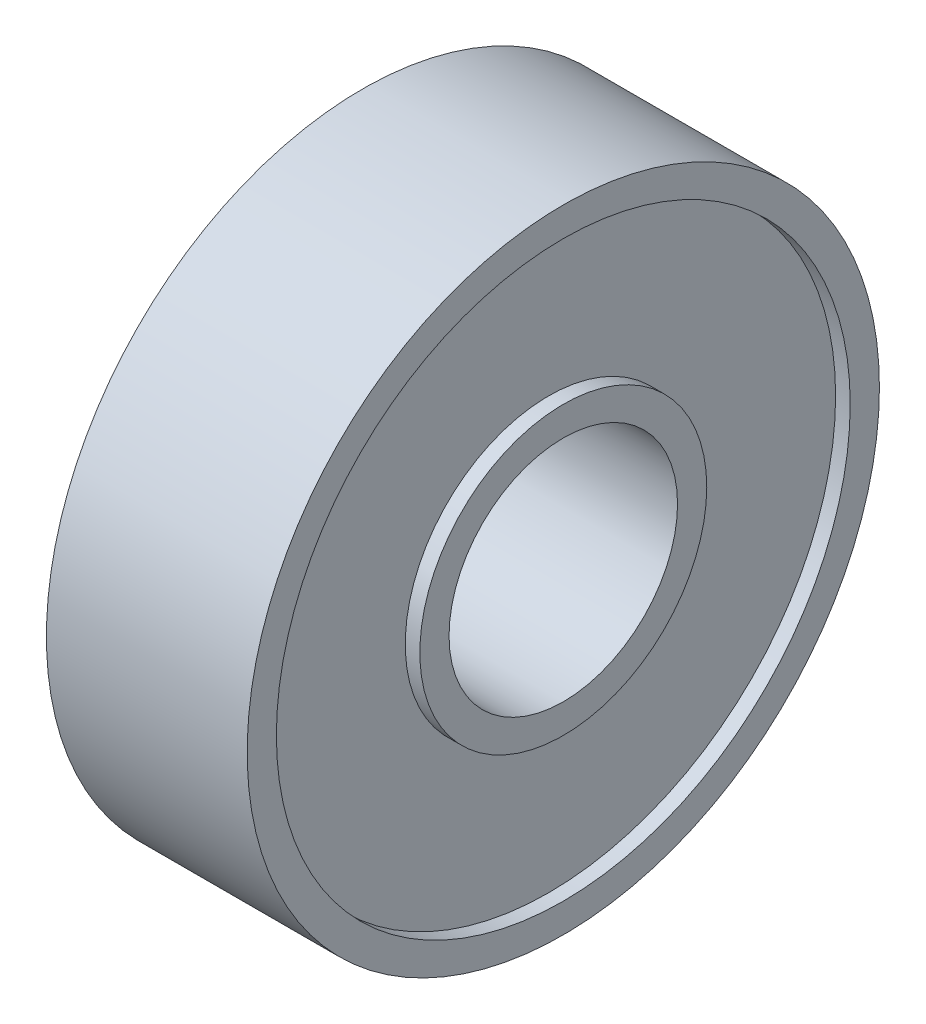
ISO-10303-21;
HEADER;
FILE_DESCRIPTION(('STEP AP214'),'2;1');
FILE_NAME('part.step','',(''),(''),'','','');
FILE_SCHEMA(('AUTOMOTIVE_DESIGN { 1 0 10303 214 1 1 1 1 }'));
ENDSEC;
DATA;
#1=APPLICATION_CONTEXT('core data for automotive mechanical design processes');
#2=APPLICATION_PROTOCOL_DEFINITION('international standard','automotive_design',2000,#1);
#3=PRODUCT_CONTEXT('',#1,'mechanical');
#4=PRODUCT('Part','Part','',(#3));
#5=PRODUCT_RELATED_PRODUCT_CATEGORY('part','',(#4));
#6=PRODUCT_DEFINITION_FORMATION('','',#4);
#7=PRODUCT_DEFINITION_CONTEXT('part definition',#1,'design');
#8=PRODUCT_DEFINITION('design','',#6,#7);
#9=PRODUCT_DEFINITION_SHAPE('','',#8);
#10=(LENGTH_UNIT() NAMED_UNIT(*) SI_UNIT(.MILLI.,.METRE.));
#11=(NAMED_UNIT(*) PLANE_ANGLE_UNIT() SI_UNIT($,.RADIAN.));
#12=(NAMED_UNIT(*) SI_UNIT($,.STERADIAN.) SOLID_ANGLE_UNIT());
#13=UNCERTAINTY_MEASURE_WITH_UNIT(LENGTH_MEASURE(1.E-05),#10,'distance_accuracy_value','');
#14=(GEOMETRIC_REPRESENTATION_CONTEXT(3) GLOBAL_UNCERTAINTY_ASSIGNED_CONTEXT((#13)) GLOBAL_UNIT_ASSIGNED_CONTEXT((#10,
#11,#12)) REPRESENTATION_CONTEXT('',''));
#15=CARTESIAN_POINT('',(0.,0.,0.));
#16=DIRECTION('',(0.,0.,1.));
#17=DIRECTION('',(1.,0.,0.));
#18=AXIS2_PLACEMENT_3D('',#15,#16,#17);
#19=CARTESIAN_POINT('',(-3.4925,0.,0.));
#20=DIRECTION('',(-1.,0.,0.));
#21=DIRECTION('',(0.,0.,-1.));
#22=AXIS2_PLACEMENT_3D('',#19,#20,#21);
#23=PLANE('',#22);
#24=CARTESIAN_POINT('',(-3.4925,0.,0.));
#25=DIRECTION('',(1.,0.,0.));
#26=DIRECTION('',(0.,0.,-1.));
#27=AXIS2_PLACEMENT_3D('',#24,#25,#26);
#28=CIRCLE('',#27,10.9982);
#29=CARTESIAN_POINT('',(-3.4925,0.,-10.9982));
#30=VERTEX_POINT('',#29);
#31=EDGE_CURVE('E56',#30,#30,#28,.T.);
#32=ORIENTED_EDGE('',*,*,#31,.F.);
#33=EDGE_LOOP('',(#32));
#34=FACE_BOUND('',#33,.T.);
#35=CARTESIAN_POINT('',(-3.4925,0.,0.));
#36=DIRECTION('',(1.,0.,0.));
#37=DIRECTION('',(0.,0.,-1.));
#38=AXIS2_PLACEMENT_3D('',#35,#36,#37);
#39=CIRCLE('',#38,9.9822);
#40=CARTESIAN_POINT('',(-3.4925,0.,-9.9822));
#41=VERTEX_POINT('',#40);
#42=EDGE_CURVE('E65',#41,#41,#39,.T.);
#43=ORIENTED_EDGE('',*,*,#42,.T.);
#44=EDGE_LOOP('',(#43));
#45=FACE_BOUND('',#44,.T.);
#46=ADVANCED_FACE('F32',(#34,#45),#23,.T.);
#47=CARTESIAN_POINT('',(3.4925,0.,0.));
#48=DIRECTION('',(1.,0.,0.));
#49=DIRECTION('',(0.,0.,-1.));
#50=AXIS2_PLACEMENT_3D('',#47,#48,#49);
#51=PLANE('',#50);
#52=CARTESIAN_POINT('',(3.4925,0.,0.));
#53=DIRECTION('',(1.,0.,0.));
#54=DIRECTION('',(0.,0.,-1.));
#55=AXIS2_PLACEMENT_3D('',#52,#53,#54);
#56=CIRCLE('',#55,3.9751);
#57=CARTESIAN_POINT('',(3.4925,0.,-3.9751));
#58=VERTEX_POINT('',#57);
#59=EDGE_CURVE('E39',#58,#58,#56,.T.);
#60=ORIENTED_EDGE('',*,*,#59,.F.);
#61=EDGE_LOOP('',(#60));
#62=FACE_BOUND('',#61,.T.);
#63=CARTESIAN_POINT('',(3.4925,0.,0.));
#64=DIRECTION('',(1.,0.,0.));
#65=DIRECTION('',(0.,0.,-1.));
#66=AXIS2_PLACEMENT_3D('',#63,#64,#65);
#67=CIRCLE('',#66,4.9911);
#68=CARTESIAN_POINT('',(3.4925,0.,-4.9911));
#69=VERTEX_POINT('',#68);
#70=EDGE_CURVE('E53',#69,#69,#67,.T.);
#71=ORIENTED_EDGE('',*,*,#70,.T.);
#72=EDGE_LOOP('',(#71));
#73=FACE_BOUND('',#72,.T.);
#74=ADVANCED_FACE('F107',(#62,#73),#51,.T.);
#75=CARTESIAN_POINT('',(3.4925,0.,0.));
#76=DIRECTION('',(1.,0.,0.));
#77=DIRECTION('',(0.,0.,-1.));
#78=AXIS2_PLACEMENT_3D('',#75,#76,#77);
#79=CIRCLE('',#78,9.9822);
#80=CARTESIAN_POINT('',(3.4925,0.,-9.9822));
#81=VERTEX_POINT('',#80);
#82=EDGE_CURVE('E47',#81,#81,#79,.T.);
#83=ORIENTED_EDGE('',*,*,#82,.F.);
#84=EDGE_LOOP('',(#83));
#85=FACE_BOUND('',#84,.T.);
#86=CARTESIAN_POINT('',(3.4925,0.,0.));
#87=DIRECTION('',(1.,0.,0.));
#88=DIRECTION('',(0.,0.,-1.));
#89=AXIS2_PLACEMENT_3D('',#86,#87,#88);
#90=CIRCLE('',#89,10.9982);
#91=CARTESIAN_POINT('',(3.4925,0.,-10.9982));
#92=VERTEX_POINT('',#91);
#93=EDGE_CURVE('E10',#92,#92,#90,.T.);
#94=ORIENTED_EDGE('',*,*,#93,.T.);
#95=EDGE_LOOP('',(#94));
#96=FACE_BOUND('',#95,.T.);
#97=ADVANCED_FACE('F104',(#85,#96),#51,.T.);
#98=CARTESIAN_POINT('',(3.4925,0.,0.));
#99=DIRECTION('',(-1.,0.,0.));
#100=DIRECTION('',(0.,0.,1.));
#101=AXIS2_PLACEMENT_3D('',#98,#99,#100);
#102=CYLINDRICAL_SURFACE('',#101,10.9982);
#103=ORIENTED_EDGE('',*,*,#93,.F.);
#104=EDGE_LOOP('',(#103));
#105=FACE_BOUND('',#104,.T.);
#106=ORIENTED_EDGE('',*,*,#31,.T.);
#107=EDGE_LOOP('',(#106));
#108=FACE_BOUND('',#107,.T.);
#109=ADVANCED_FACE('F34',(#105,#108),#102,.T.);
#110=CARTESIAN_POINT('',(3.4925,0.,0.));
#111=DIRECTION('',(-1.,0.,0.));
#112=DIRECTION('',(0.,0.,1.));
#113=AXIS2_PLACEMENT_3D('',#110,#111,#112);
#114=CYLINDRICAL_SURFACE('',#113,3.9751);
#115=ORIENTED_EDGE('',*,*,#59,.T.);
#116=EDGE_LOOP('',(#115));
#117=FACE_BOUND('',#116,.T.);
#118=CARTESIAN_POINT('',(-3.4925,0.,0.));
#119=DIRECTION('',(1.,0.,0.));
#120=DIRECTION('',(0.,0.,-1.));
#121=AXIS2_PLACEMENT_3D('',#118,#119,#120);
#122=CIRCLE('',#121,3.9751);
#123=CARTESIAN_POINT('',(-3.4925,0.,-3.9751));
#124=VERTEX_POINT('',#123);
#125=EDGE_CURVE('E61',#124,#124,#122,.T.);
#126=ORIENTED_EDGE('',*,*,#125,.F.);
#127=EDGE_LOOP('',(#126));
#128=FACE_BOUND('',#127,.T.);
#129=ADVANCED_FACE('F93',(#117,#128),#114,.F.);
#130=CARTESIAN_POINT('',(2.9845,0.,0.));
#131=DIRECTION('',(1.,0.,0.));
#132=DIRECTION('',(0.,0.,-1.));
#133=AXIS2_PLACEMENT_3D('',#130,#131,#132);
#134=CYLINDRICAL_SURFACE('',#133,9.9822);
#135=CARTESIAN_POINT('',(2.9845,0.,0.));
#136=DIRECTION('',(1.,0.,0.));
#137=DIRECTION('',(0.,0.,-1.));
#138=AXIS2_PLACEMENT_3D('',#135,#136,#137);
#139=CIRCLE('',#138,9.9822);
#140=CARTESIAN_POINT('',(2.9845,0.,-9.9822));
#141=VERTEX_POINT('',#140);
#142=EDGE_CURVE('E43',#141,#141,#139,.T.);
#143=ORIENTED_EDGE('',*,*,#142,.F.);
#144=EDGE_LOOP('',(#143));
#145=FACE_BOUND('',#144,.T.);
#146=ORIENTED_EDGE('',*,*,#82,.T.);
#147=EDGE_LOOP('',(#146));
#148=FACE_BOUND('',#147,.T.);
#149=ADVANCED_FACE('F95',(#145,#148),#134,.F.);
#150=CARTESIAN_POINT('',(2.9845,0.,0.));
#151=DIRECTION('',(1.,0.,0.));
#152=DIRECTION('',(0.,0.,-1.));
#153=AXIS2_PLACEMENT_3D('',#150,#151,#152);
#154=PLANE('',#153);
#155=CARTESIAN_POINT('',(2.9845,0.,0.));
#156=DIRECTION('',(1.,0.,0.));
#157=DIRECTION('',(0.,0.,-1.));
#158=AXIS2_PLACEMENT_3D('',#155,#156,#157);
#159=CIRCLE('',#158,4.9911);
#160=CARTESIAN_POINT('',(2.9845,0.,-4.9911));
#161=VERTEX_POINT('',#160);
#162=EDGE_CURVE('E51',#161,#161,#159,.T.);
#163=ORIENTED_EDGE('',*,*,#162,.F.);
#164=EDGE_LOOP('',(#163));
#165=FACE_BOUND('',#164,.T.);
#166=ORIENTED_EDGE('',*,*,#142,.T.);
#167=EDGE_LOOP('',(#166));
#168=FACE_BOUND('',#167,.T.);
#169=ADVANCED_FACE('F101',(#165,#168),#154,.T.);
#170=CARTESIAN_POINT('',(2.9845,0.,0.));
#171=DIRECTION('',(1.,0.,0.));
#172=DIRECTION('',(0.,0.,-1.));
#173=AXIS2_PLACEMENT_3D('',#170,#171,#172);
#174=CYLINDRICAL_SURFACE('',#173,4.9911);
#175=ORIENTED_EDGE('',*,*,#162,.T.);
#176=EDGE_LOOP('',(#175));
#177=FACE_BOUND('',#176,.T.);
#178=ORIENTED_EDGE('',*,*,#70,.F.);
#179=EDGE_LOOP('',(#178));
#180=FACE_BOUND('',#179,.T.);
#181=ADVANCED_FACE('F89',(#177,#180),#174,.T.);
#182=CARTESIAN_POINT('',(-3.4925,0.,0.));
#183=DIRECTION('',(1.,0.,0.));
#184=DIRECTION('',(0.,0.,-1.));
#185=AXIS2_PLACEMENT_3D('',#182,#183,#184);
#186=CIRCLE('',#185,4.9911);
#187=CARTESIAN_POINT('',(-3.4925,0.,-4.9911));
#188=VERTEX_POINT('',#187);
#189=EDGE_CURVE('E71',#188,#188,#186,.T.);
#190=ORIENTED_EDGE('',*,*,#189,.F.);
#191=EDGE_LOOP('',(#190));
#192=FACE_BOUND('',#191,.T.);
#193=ORIENTED_EDGE('',*,*,#125,.T.);
#194=EDGE_LOOP('',(#193));
#195=FACE_BOUND('',#194,.T.);
#196=ADVANCED_FACE('F86',(#192,#195),#23,.T.);
#197=CARTESIAN_POINT('',(-2.9845,0.,0.));
#198=DIRECTION('',(-1.,0.,0.));
#199=DIRECTION('',(0.,0.,-1.));
#200=AXIS2_PLACEMENT_3D('',#197,#198,#199);
#201=PLANE('',#200);
#202=CARTESIAN_POINT('',(-2.9845,0.,0.));
#203=DIRECTION('',(1.,0.,0.));
#204=DIRECTION('',(0.,0.,-1.));
#205=AXIS2_PLACEMENT_3D('',#202,#203,#204);
#206=CIRCLE('',#205,9.9822);
#207=CARTESIAN_POINT('',(-2.9845,0.,-9.9822));
#208=VERTEX_POINT('',#207);
#209=EDGE_CURVE('E64',#208,#208,#206,.T.);
#210=ORIENTED_EDGE('',*,*,#209,.F.);
#211=EDGE_LOOP('',(#210));
#212=FACE_BOUND('',#211,.T.);
#213=CARTESIAN_POINT('',(-2.9845,0.,0.));
#214=DIRECTION('',(1.,0.,0.));
#215=DIRECTION('',(0.,0.,-1.));
#216=AXIS2_PLACEMENT_3D('',#213,#214,#215);
#217=CIRCLE('',#216,4.9911);
#218=CARTESIAN_POINT('',(-2.9845,0.,-4.9911));
#219=VERTEX_POINT('',#218);
#220=EDGE_CURVE('E68',#219,#219,#217,.T.);
#221=ORIENTED_EDGE('',*,*,#220,.T.);
#222=EDGE_LOOP('',(#221));
#223=FACE_BOUND('',#222,.T.);
#224=ADVANCED_FACE('F77',(#212,#223),#201,.T.);
#225=CARTESIAN_POINT('',(-2.9845,0.,0.));
#226=DIRECTION('',(-1.,0.,0.));
#227=DIRECTION('',(0.,0.,1.));
#228=AXIS2_PLACEMENT_3D('',#225,#226,#227);
#229=CYLINDRICAL_SURFACE('',#228,9.9822);
#230=ORIENTED_EDGE('',*,*,#209,.T.);
#231=EDGE_LOOP('',(#230));
#232=FACE_BOUND('',#231,.T.);
#233=ORIENTED_EDGE('',*,*,#42,.F.);
#234=EDGE_LOOP('',(#233));
#235=FACE_BOUND('',#234,.T.);
#236=ADVANCED_FACE('F82',(#232,#235),#229,.F.);
#237=CARTESIAN_POINT('',(-2.9845,0.,0.));
#238=DIRECTION('',(-1.,0.,0.));
#239=DIRECTION('',(0.,0.,1.));
#240=AXIS2_PLACEMENT_3D('',#237,#238,#239);
#241=CYLINDRICAL_SURFACE('',#240,4.9911);
#242=ORIENTED_EDGE('',*,*,#220,.F.);
#243=EDGE_LOOP('',(#242));
#244=FACE_BOUND('',#243,.T.);
#245=ORIENTED_EDGE('',*,*,#189,.T.);
#246=EDGE_LOOP('',(#245));
#247=FACE_BOUND('',#246,.T.);
#248=ADVANCED_FACE('F79',(#244,#247),#241,.T.);
#249=CLOSED_SHELL('',(#46,#74,#97,#109,#129,#149,#169,#181,#196,#224,#236,#248));
#250=MANIFOLD_SOLID_BREP('B2',#249);
#251=ADVANCED_BREP_SHAPE_REPRESENTATION('',(#18,#250),#14);
#252=SHAPE_DEFINITION_REPRESENTATION(#9,#251);
ENDSEC;
END-ISO-10303-21;
